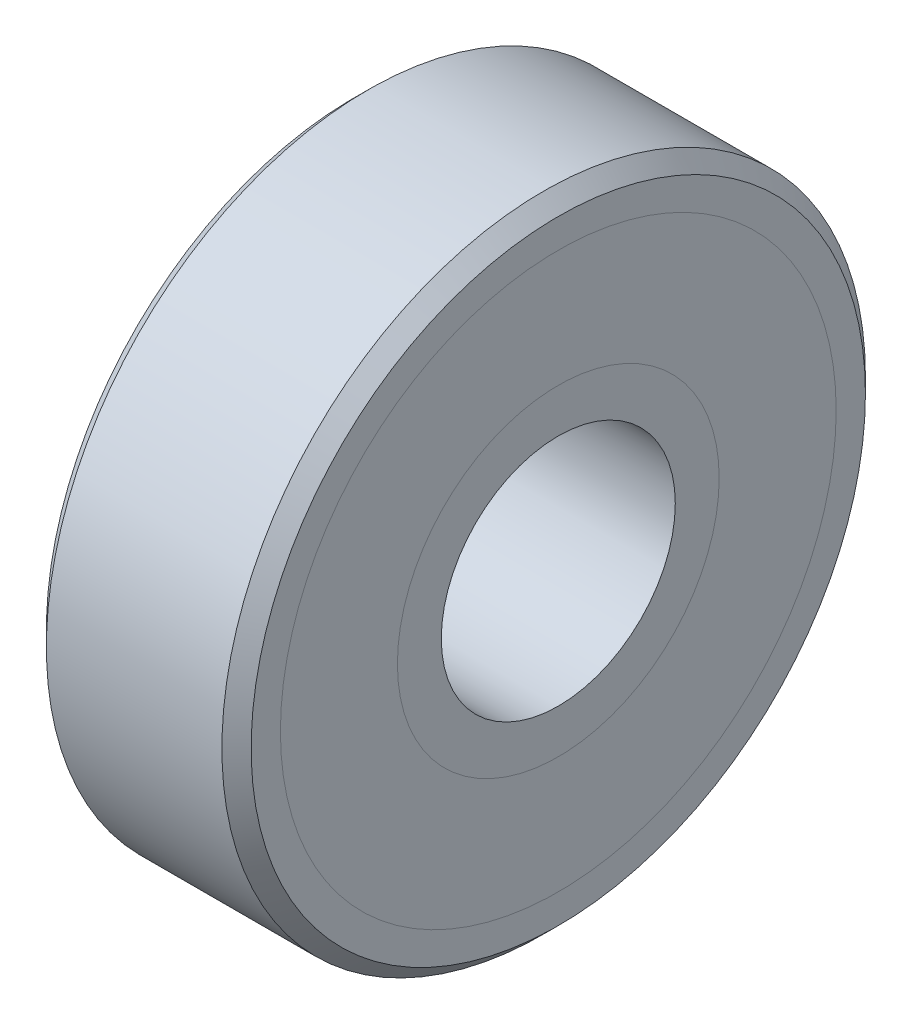
ISO-10303-21;
HEADER;
FILE_DESCRIPTION(('STEP AP214'),'2;1');
FILE_NAME('part.step','',(''),(''),'','','');
FILE_SCHEMA(('AUTOMOTIVE_DESIGN { 1 0 10303 214 1 1 1 1 }'));
ENDSEC;
DATA;
#1=APPLICATION_CONTEXT('core data for automotive mechanical design processes');
#2=APPLICATION_PROTOCOL_DEFINITION('international standard','automotive_design',2000,#1);
#3=PRODUCT_CONTEXT('',#1,'mechanical');
#4=PRODUCT('Part','Part','',(#3));
#5=PRODUCT_RELATED_PRODUCT_CATEGORY('part','',(#4));
#6=PRODUCT_DEFINITION_FORMATION('','',#4);
#7=PRODUCT_DEFINITION_CONTEXT('part definition',#1,'design');
#8=PRODUCT_DEFINITION('design','',#6,#7);
#9=PRODUCT_DEFINITION_SHAPE('','',#8);
#10=(LENGTH_UNIT() NAMED_UNIT(*) SI_UNIT(.MILLI.,.METRE.));
#11=(NAMED_UNIT(*) PLANE_ANGLE_UNIT() SI_UNIT($,.RADIAN.));
#12=(NAMED_UNIT(*) SI_UNIT($,.STERADIAN.) SOLID_ANGLE_UNIT());
#13=UNCERTAINTY_MEASURE_WITH_UNIT(LENGTH_MEASURE(1.E-05),#10,'distance_accuracy_value','');
#14=(GEOMETRIC_REPRESENTATION_CONTEXT(3) GLOBAL_UNCERTAINTY_ASSIGNED_CONTEXT((#13)) GLOBAL_UNIT_ASSIGNED_CONTEXT((#10,
#11,#12)) REPRESENTATION_CONTEXT('',''));
#15=CARTESIAN_POINT('',(0.,0.,0.));
#16=DIRECTION('',(0.,0.,1.));
#17=DIRECTION('',(1.,0.,0.));
#18=AXIS2_PLACEMENT_3D('',#15,#16,#17);
#19=CARTESIAN_POINT('',(-3.5,0.,0.));
#20=DIRECTION('',(1.,0.,0.));
#21=DIRECTION('',(0.,0.,-1.));
#22=AXIS2_PLACEMENT_3D('',#19,#20,#21);
#23=PLANE('',#22);
#24=CARTESIAN_POINT('',(-3.5,0.,0.));
#25=DIRECTION('',(1.,0.,0.));
#26=DIRECTION('',(0.,0.,-1.));
#27=AXIS2_PLACEMENT_3D('',#24,#25,#26);
#28=CIRCLE('',#27,10.5);
#29=CARTESIAN_POINT('',(-3.5,0.,-10.5));
#30=VERTEX_POINT('',#29);
#31=EDGE_CURVE('E10',#30,#30,#28,.F.);
#32=ORIENTED_EDGE('',*,*,#31,.T.);
#33=EDGE_LOOP('',(#32));
#34=FACE_BOUND('',#33,.T.);
#35=CARTESIAN_POINT('',(-3.5,0.,0.));
#36=DIRECTION('',(1.,0.,0.));
#37=DIRECTION('',(0.,0.,-1.));
#38=AXIS2_PLACEMENT_3D('',#35,#36,#37);
#39=CIRCLE('',#38,9.5);
#40=CARTESIAN_POINT('',(-3.5,0.,-9.5));
#41=VERTEX_POINT('',#40);
#42=EDGE_CURVE('E57',#41,#41,#39,.F.);
#43=ORIENTED_EDGE('',*,*,#42,.F.);
#44=EDGE_LOOP('',(#43));
#45=FACE_BOUND('',#44,.T.);
#46=ADVANCED_FACE('F37',(#34,#45),#23,.F.);
#47=CARTESIAN_POINT('',(3.5,0.,0.));
#48=DIRECTION('',(1.,0.,0.));
#49=DIRECTION('',(0.,0.,-1.));
#50=AXIS2_PLACEMENT_3D('',#47,#48,#49);
#51=PLANE('',#50);
#52=CARTESIAN_POINT('',(3.5,0.,0.));
#53=DIRECTION('',(1.,0.,0.));
#54=DIRECTION('',(0.,0.,-1.));
#55=AXIS2_PLACEMENT_3D('',#52,#53,#54);
#56=CIRCLE('',#55,10.5);
#57=CARTESIAN_POINT('',(3.5,0.,-10.5));
#58=VERTEX_POINT('',#57);
#59=EDGE_CURVE('E52',#58,#58,#56,.T.);
#60=ORIENTED_EDGE('',*,*,#59,.T.);
#61=EDGE_LOOP('',(#60));
#62=FACE_BOUND('',#61,.T.);
#63=CARTESIAN_POINT('',(3.5,0.,0.));
#64=DIRECTION('',(1.,0.,0.));
#65=DIRECTION('',(0.,0.,-1.));
#66=AXIS2_PLACEMENT_3D('',#63,#64,#65);
#67=CIRCLE('',#66,9.5);
#68=CARTESIAN_POINT('',(3.5,0.,-9.5));
#69=VERTEX_POINT('',#68);
#70=EDGE_CURVE('E58',#69,#69,#67,.F.);
#71=ORIENTED_EDGE('',*,*,#70,.T.);
#72=EDGE_LOOP('',(#71));
#73=FACE_BOUND('',#72,.T.);
#74=ADVANCED_FACE('F89',(#62,#73),#51,.T.);
#75=ORIENTED_EDGE('',*,*,#42,.T.);
#76=EDGE_LOOP('',(#75));
#77=FACE_BOUND('',#76,.T.);
#78=CARTESIAN_POINT('',(-3.5,0.,0.));
#79=DIRECTION('',(1.,0.,0.));
#80=DIRECTION('',(0.,0.,-1.));
#81=AXIS2_PLACEMENT_3D('',#78,#79,#80);
#82=CIRCLE('',#81,5.5);
#83=CARTESIAN_POINT('',(-3.5,0.,-5.5));
#84=VERTEX_POINT('',#83);
#85=EDGE_CURVE('E62',#84,#84,#82,.F.);
#86=ORIENTED_EDGE('',*,*,#85,.F.);
#87=EDGE_LOOP('',(#86));
#88=FACE_BOUND('',#87,.T.);
#89=ADVANCED_FACE('F97',(#77,#88),#23,.F.);
#90=ORIENTED_EDGE('',*,*,#70,.F.);
#91=EDGE_LOOP('',(#90));
#92=FACE_BOUND('',#91,.T.);
#93=CARTESIAN_POINT('',(3.5,0.,0.));
#94=DIRECTION('',(1.,0.,0.));
#95=DIRECTION('',(0.,0.,-1.));
#96=AXIS2_PLACEMENT_3D('',#93,#94,#95);
#97=CIRCLE('',#96,5.5);
#98=CARTESIAN_POINT('',(3.5,0.,-5.5));
#99=VERTEX_POINT('',#98);
#100=EDGE_CURVE('E66',#99,#99,#97,.F.);
#101=ORIENTED_EDGE('',*,*,#100,.T.);
#102=EDGE_LOOP('',(#101));
#103=FACE_BOUND('',#102,.T.);
#104=ADVANCED_FACE('F86',(#92,#103),#51,.T.);
#105=ORIENTED_EDGE('',*,*,#100,.F.);
#106=EDGE_LOOP('',(#105));
#107=FACE_BOUND('',#106,.T.);
#108=CARTESIAN_POINT('',(3.5,0.,0.));
#109=DIRECTION('',(1.,0.,0.));
#110=DIRECTION('',(0.,0.,-1.));
#111=AXIS2_PLACEMENT_3D('',#108,#109,#110);
#112=CIRCLE('',#111,4.);
#113=CARTESIAN_POINT('',(3.5,0.,-4.));
#114=VERTEX_POINT('',#113);
#115=EDGE_CURVE('E70',#114,#114,#112,.T.);
#116=ORIENTED_EDGE('',*,*,#115,.F.);
#117=EDGE_LOOP('',(#116));
#118=FACE_BOUND('',#117,.T.);
#119=ADVANCED_FACE('F83',(#107,#118),#51,.T.);
#120=ORIENTED_EDGE('',*,*,#85,.T.);
#121=EDGE_LOOP('',(#120));
#122=FACE_BOUND('',#121,.T.);
#123=CARTESIAN_POINT('',(-3.5,0.,0.));
#124=DIRECTION('',(1.,0.,0.));
#125=DIRECTION('',(0.,0.,-1.));
#126=AXIS2_PLACEMENT_3D('',#123,#124,#125);
#127=CIRCLE('',#126,4.);
#128=CARTESIAN_POINT('',(-3.5,0.,-4.));
#129=VERTEX_POINT('',#128);
#130=EDGE_CURVE('E74',#129,#129,#127,.T.);
#131=ORIENTED_EDGE('',*,*,#130,.T.);
#132=EDGE_LOOP('',(#131));
#133=FACE_BOUND('',#132,.T.);
#134=ADVANCED_FACE('F85',(#122,#133),#23,.F.);
#135=CARTESIAN_POINT('',(3.5,0.,0.));
#136=DIRECTION('',(-1.,0.,0.));
#137=DIRECTION('',(0.,0.,1.));
#138=AXIS2_PLACEMENT_3D('',#135,#136,#137);
#139=CYLINDRICAL_SURFACE('',#138,11.);
#140=CARTESIAN_POINT('',(3.,0.,0.));
#141=DIRECTION('',(1.,0.,0.));
#142=DIRECTION('',(0.,0.,-1.));
#143=AXIS2_PLACEMENT_3D('',#140,#141,#142);
#144=CIRCLE('',#143,11.);
#145=CARTESIAN_POINT('',(3.,0.,-11.));
#146=VERTEX_POINT('',#145);
#147=EDGE_CURVE('E44',#146,#146,#144,.F.);
#148=ORIENTED_EDGE('',*,*,#147,.T.);
#149=EDGE_LOOP('',(#148));
#150=FACE_BOUND('',#149,.T.);
#151=CARTESIAN_POINT('',(-3.,0.,0.));
#152=DIRECTION('',(1.,0.,0.));
#153=DIRECTION('',(0.,0.,-1.));
#154=AXIS2_PLACEMENT_3D('',#151,#152,#153);
#155=CIRCLE('',#154,11.);
#156=CARTESIAN_POINT('',(-3.,0.,-11.));
#157=VERTEX_POINT('',#156);
#158=EDGE_CURVE('E48',#157,#157,#155,.T.);
#159=ORIENTED_EDGE('',*,*,#158,.T.);
#160=EDGE_LOOP('',(#159));
#161=FACE_BOUND('',#160,.T.);
#162=ADVANCED_FACE('F94',(#150,#161),#139,.T.);
#163=CARTESIAN_POINT('',(3.5,0.,0.));
#164=DIRECTION('',(-1.,0.,0.));
#165=DIRECTION('',(0.,0.,1.));
#166=AXIS2_PLACEMENT_3D('',#163,#164,#165);
#167=CYLINDRICAL_SURFACE('',#166,4.);
#168=ORIENTED_EDGE('',*,*,#115,.T.);
#169=EDGE_LOOP('',(#168));
#170=FACE_BOUND('',#169,.T.);
#171=ORIENTED_EDGE('',*,*,#130,.F.);
#172=EDGE_LOOP('',(#171));
#173=FACE_BOUND('',#172,.T.);
#174=ADVANCED_FACE('F80',(#170,#173),#167,.F.);
#175=CARTESIAN_POINT('',(3.5,0.,0.));
#176=DIRECTION('',(-1.,0.,0.));
#177=DIRECTION('',(0.,0.,1.));
#178=AXIS2_PLACEMENT_3D('',#175,#176,#177);
#179=CONICAL_SURFACE('',#178,10.5,0.785398163397448);
#180=ORIENTED_EDGE('',*,*,#147,.F.);
#181=EDGE_LOOP('',(#180));
#182=FACE_BOUND('',#181,.T.);
#183=ORIENTED_EDGE('',*,*,#59,.F.);
#184=EDGE_LOOP('',(#183));
#185=FACE_BOUND('',#184,.T.);
#186=ADVANCED_FACE('F118',(#182,#185),#179,.T.);
#187=CARTESIAN_POINT('',(-3.,0.,0.));
#188=DIRECTION('',(1.,0.,0.));
#189=DIRECTION('',(0.,0.,-1.));
#190=AXIS2_PLACEMENT_3D('',#187,#188,#189);
#191=CONICAL_SURFACE('',#190,11.,0.785398163397452);
#192=ORIENTED_EDGE('',*,*,#31,.F.);
#193=EDGE_LOOP('',(#192));
#194=FACE_BOUND('',#193,.T.);
#195=ORIENTED_EDGE('',*,*,#158,.F.);
#196=EDGE_LOOP('',(#195));
#197=FACE_BOUND('',#196,.T.);
#198=ADVANCED_FACE('F39',(#194,#197),#191,.T.);
#199=CLOSED_SHELL('',(#46,#74,#89,#104,#119,#134,#162,#174,#186,#198));
#200=MANIFOLD_SOLID_BREP('B2',#199);
#201=ADVANCED_BREP_SHAPE_REPRESENTATION('',(#18,#200),#14);
#202=SHAPE_DEFINITION_REPRESENTATION(#9,#201);
ENDSEC;
END-ISO-10303-21;
